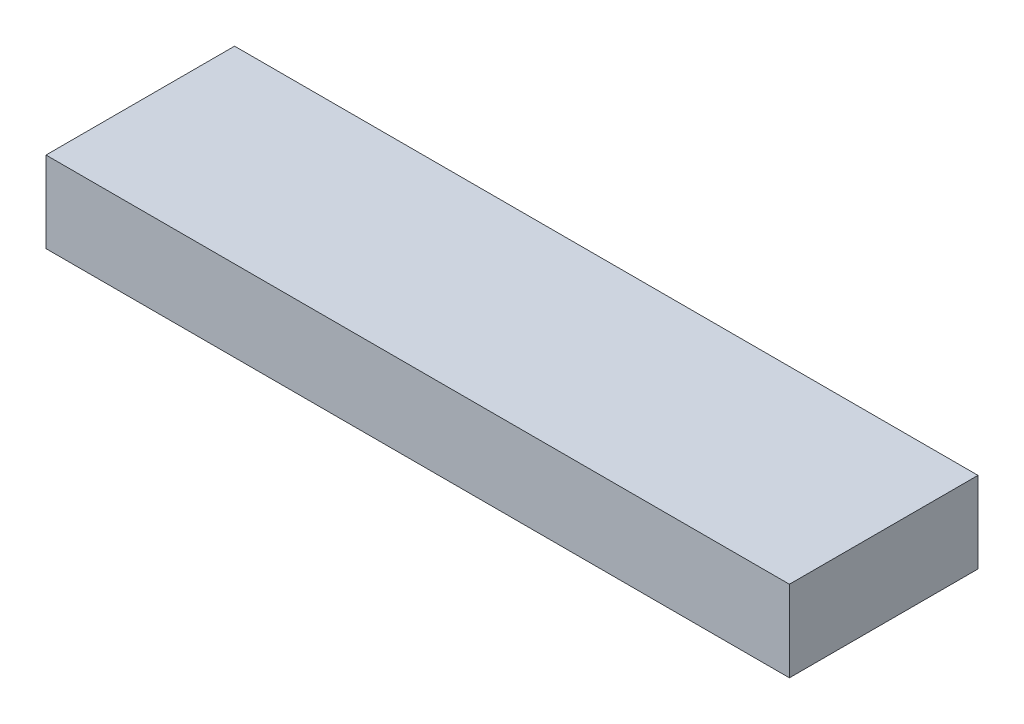
ISO-10303-21;
HEADER;
FILE_DESCRIPTION(('STEP AP214'),'2;1');
FILE_NAME('part.step','',(''),(''),'','','');
FILE_SCHEMA(('AUTOMOTIVE_DESIGN { 1 0 10303 214 1 1 1 1 }'));
ENDSEC;
DATA;
#1=APPLICATION_CONTEXT('core data for automotive mechanical design processes');
#2=APPLICATION_PROTOCOL_DEFINITION('international standard','automotive_design',2000,#1);
#3=PRODUCT_CONTEXT('',#1,'mechanical');
#4=PRODUCT('Part','Part','',(#3));
#5=PRODUCT_RELATED_PRODUCT_CATEGORY('part','',(#4));
#6=PRODUCT_DEFINITION_FORMATION('','',#4);
#7=PRODUCT_DEFINITION_CONTEXT('part definition',#1,'design');
#8=PRODUCT_DEFINITION('design','',#6,#7);
#9=PRODUCT_DEFINITION_SHAPE('','',#8);
#10=(LENGTH_UNIT() NAMED_UNIT(*) SI_UNIT(.MILLI.,.METRE.));
#11=(NAMED_UNIT(*) PLANE_ANGLE_UNIT() SI_UNIT($,.RADIAN.));
#12=(NAMED_UNIT(*) SI_UNIT($,.STERADIAN.) SOLID_ANGLE_UNIT());
#13=UNCERTAINTY_MEASURE_WITH_UNIT(LENGTH_MEASURE(1.E-05),#10,'distance_accuracy_value','');
#14=(GEOMETRIC_REPRESENTATION_CONTEXT(3) GLOBAL_UNCERTAINTY_ASSIGNED_CONTEXT((#13)) GLOBAL_UNIT_ASSIGNED_CONTEXT((#10,
#11,#12)) REPRESENTATION_CONTEXT('',''));
#15=CARTESIAN_POINT('',(0.,0.,0.));
#16=DIRECTION('',(0.,0.,1.));
#17=DIRECTION('',(1.,0.,0.));
#18=AXIS2_PLACEMENT_3D('',#15,#16,#17);
#19=CARTESIAN_POINT('',(-19.71,4.29999999999999,10.));
#20=DIRECTION('',(1.,0.,0.));
#21=DIRECTION('',(0.,0.,-1.));
#22=AXIS2_PLACEMENT_3D('',#19,#20,#21);
#23=PLANE('',#22);
#24=DIRECTION('',(0.,-1.,0.));
#25=VECTOR('',#24,1.);
#26=CARTESIAN_POINT('',(-19.71,4.29999999999999,0.));
#27=LINE('',#26,#25);
#28=CARTESIAN_POINT('',(-19.71,4.29999999999999,0.));
#29=VERTEX_POINT('',#28);
#30=CARTESIAN_POINT('',(-19.71,0.,0.));
#31=VERTEX_POINT('',#30);
#32=EDGE_CURVE('E98',#29,#31,#27,.T.);
#33=ORIENTED_EDGE('',*,*,#32,.T.);
#34=DIRECTION('',(0.,0.,-1.));
#35=VECTOR('',#34,1.);
#36=CARTESIAN_POINT('',(-19.71,0.,10.));
#37=LINE('',#36,#35);
#38=CARTESIAN_POINT('',(-19.71,0.,10.));
#39=VERTEX_POINT('',#38);
#40=EDGE_CURVE('E11',#39,#31,#37,.T.);
#41=ORIENTED_EDGE('',*,*,#40,.F.);
#42=DIRECTION('',(0.,-1.,0.));
#43=VECTOR('',#42,1.);
#44=CARTESIAN_POINT('',(-19.71,4.29999999999999,10.));
#45=LINE('',#44,#43);
#46=CARTESIAN_POINT('',(-19.71,4.29999999999999,10.));
#47=VERTEX_POINT('',#46);
#48=EDGE_CURVE('E86',#47,#39,#45,.T.);
#49=ORIENTED_EDGE('',*,*,#48,.F.);
#50=DIRECTION('',(0.,0.,-1.));
#51=VECTOR('',#50,1.);
#52=CARTESIAN_POINT('',(-19.71,4.29999999999999,10.));
#53=LINE('',#52,#51);
#54=EDGE_CURVE('E94',#47,#29,#53,.T.);
#55=ORIENTED_EDGE('',*,*,#54,.T.);
#56=EDGE_LOOP('',(#33,#41,#49,#55));
#57=FACE_BOUND('',#56,.T.);
#58=ADVANCED_FACE('F35',(#57),#23,.F.);
#59=CARTESIAN_POINT('',(-19.71,0.,10.));
#60=DIRECTION('',(0.,1.,0.));
#61=DIRECTION('',(-1.,0.,0.));
#62=AXIS2_PLACEMENT_3D('',#59,#60,#61);
#63=PLANE('',#62);
#64=DIRECTION('',(1.,0.,0.));
#65=VECTOR('',#64,1.);
#66=CARTESIAN_POINT('',(-19.71,0.,0.));
#67=LINE('',#66,#65);
#68=CARTESIAN_POINT('',(19.71,0.,0.));
#69=VERTEX_POINT('',#68);
#70=EDGE_CURVE('E90',#31,#69,#67,.T.);
#71=ORIENTED_EDGE('',*,*,#70,.T.);
#72=DIRECTION('',(0.,0.,-1.));
#73=VECTOR('',#72,1.);
#74=CARTESIAN_POINT('',(19.71,0.,10.));
#75=LINE('',#74,#73);
#76=CARTESIAN_POINT('',(19.71,0.,10.));
#77=VERTEX_POINT('',#76);
#78=EDGE_CURVE('E43',#77,#69,#75,.T.);
#79=ORIENTED_EDGE('',*,*,#78,.F.);
#80=DIRECTION('',(1.,0.,0.));
#81=VECTOR('',#80,1.);
#82=CARTESIAN_POINT('',(-19.71,0.,10.));
#83=LINE('',#82,#81);
#84=EDGE_CURVE('E81',#39,#77,#83,.T.);
#85=ORIENTED_EDGE('',*,*,#84,.F.);
#86=ORIENTED_EDGE('',*,*,#40,.T.);
#87=EDGE_LOOP('',(#71,#79,#85,#86));
#88=FACE_BOUND('',#87,.T.);
#89=ADVANCED_FACE('F89',(#88),#63,.F.);
#90=CARTESIAN_POINT('',(19.71,4.29999999999999,10.));
#91=DIRECTION('',(-1.,0.,0.));
#92=DIRECTION('',(0.,0.,1.));
#93=AXIS2_PLACEMENT_3D('',#90,#91,#92);
#94=PLANE('',#93);
#95=DIRECTION('',(0.,1.,0.));
#96=VECTOR('',#95,1.);
#97=CARTESIAN_POINT('',(19.71,4.29999999999999,0.));
#98=LINE('',#97,#96);
#99=CARTESIAN_POINT('',(19.71,4.29999999999999,0.));
#100=VERTEX_POINT('',#99);
#101=EDGE_CURVE('E68',#69,#100,#98,.T.);
#102=ORIENTED_EDGE('',*,*,#101,.T.);
#103=DIRECTION('',(0.,0.,-1.));
#104=VECTOR('',#103,1.);
#105=CARTESIAN_POINT('',(19.71,4.29999999999999,10.));
#106=LINE('',#105,#104);
#107=CARTESIAN_POINT('',(19.71,4.29999999999999,10.));
#108=VERTEX_POINT('',#107);
#109=EDGE_CURVE('E91',#108,#100,#106,.T.);
#110=ORIENTED_EDGE('',*,*,#109,.F.);
#111=DIRECTION('',(0.,1.,0.));
#112=VECTOR('',#111,1.);
#113=CARTESIAN_POINT('',(19.71,4.29999999999999,10.));
#114=LINE('',#113,#112);
#115=EDGE_CURVE('E84',#77,#108,#114,.T.);
#116=ORIENTED_EDGE('',*,*,#115,.F.);
#117=ORIENTED_EDGE('',*,*,#78,.T.);
#118=EDGE_LOOP('',(#102,#110,#116,#117));
#119=FACE_BOUND('',#118,.T.);
#120=ADVANCED_FACE('F92',(#119),#94,.F.);
#121=CARTESIAN_POINT('',(-19.71,4.29999999999999,10.));
#122=DIRECTION('',(0.,-1.,0.));
#123=DIRECTION('',(0.,0.,-1.));
#124=AXIS2_PLACEMENT_3D('',#121,#122,#123);
#125=PLANE('',#124);
#126=DIRECTION('',(-1.,0.,0.));
#127=VECTOR('',#126,1.);
#128=CARTESIAN_POINT('',(-19.71,4.29999999999999,0.));
#129=LINE('',#128,#127);
#130=EDGE_CURVE('E74',#100,#29,#129,.T.);
#131=ORIENTED_EDGE('',*,*,#130,.T.);
#132=ORIENTED_EDGE('',*,*,#54,.F.);
#133=DIRECTION('',(-1.,0.,0.));
#134=VECTOR('',#133,1.);
#135=CARTESIAN_POINT('',(-19.71,4.29999999999999,10.));
#136=LINE('',#135,#134);
#137=EDGE_CURVE('E51',#108,#47,#136,.T.);
#138=ORIENTED_EDGE('',*,*,#137,.F.);
#139=ORIENTED_EDGE('',*,*,#109,.T.);
#140=EDGE_LOOP('',(#131,#132,#138,#139));
#141=FACE_BOUND('',#140,.T.);
#142=ADVANCED_FACE('F105',(#141),#125,.F.);
#143=CARTESIAN_POINT('',(0.,0.,10.));
#144=DIRECTION('',(0.,0.,1.));
#145=DIRECTION('',(1.,0.,0.));
#146=AXIS2_PLACEMENT_3D('',#143,#144,#145);
#147=PLANE('',#146);
#148=ORIENTED_EDGE('',*,*,#48,.T.);
#149=ORIENTED_EDGE('',*,*,#84,.T.);
#150=ORIENTED_EDGE('',*,*,#115,.T.);
#151=ORIENTED_EDGE('',*,*,#137,.T.);
#152=EDGE_LOOP('',(#148,#149,#150,#151));
#153=FACE_BOUND('',#152,.T.);
#154=ADVANCED_FACE('F82',(#153),#147,.T.);
#155=CARTESIAN_POINT('',(0.,0.,0.));
#156=DIRECTION('',(0.,0.,1.));
#157=DIRECTION('',(1.,0.,0.));
#158=AXIS2_PLACEMENT_3D('',#155,#156,#157);
#159=PLANE('',#158);
#160=ORIENTED_EDGE('',*,*,#32,.F.);
#161=ORIENTED_EDGE('',*,*,#130,.F.);
#162=ORIENTED_EDGE('',*,*,#101,.F.);
#163=ORIENTED_EDGE('',*,*,#70,.F.);
#164=EDGE_LOOP('',(#160,#161,#162,#163));
#165=FACE_BOUND('',#164,.T.);
#166=ADVANCED_FACE('F108',(#165),#159,.F.);
#167=CLOSED_SHELL('',(#58,#89,#120,#142,#154,#166));
#168=MANIFOLD_SOLID_BREP('B2',#167);
#169=ADVANCED_BREP_SHAPE_REPRESENTATION('',(#18,#168),#14);
#170=SHAPE_DEFINITION_REPRESENTATION(#9,#169);
ENDSEC;
END-ISO-10303-21;
